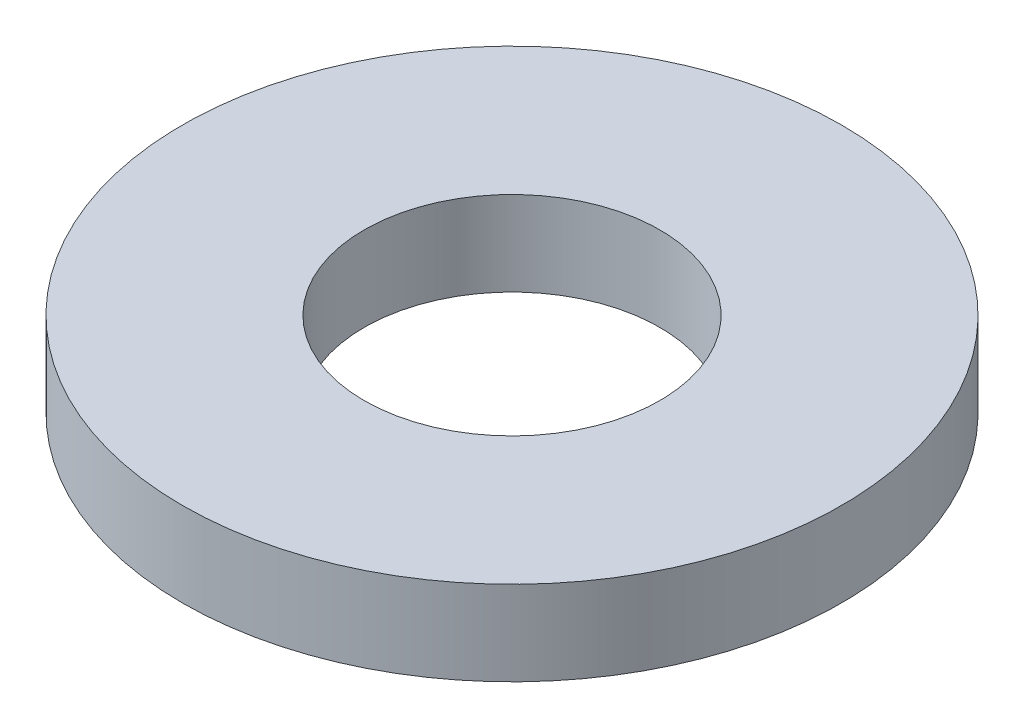
ISO-10303-21;
HEADER;
FILE_DESCRIPTION(('STEP AP214'),'2;1');
FILE_NAME('part.step','',(''),(''),'','','');
FILE_SCHEMA(('AUTOMOTIVE_DESIGN { 1 0 10303 214 1 1 1 1 }'));
ENDSEC;
DATA;
#1=APPLICATION_CONTEXT('core data for automotive mechanical design processes');
#2=APPLICATION_PROTOCOL_DEFINITION('international standard','automotive_design',2000,#1);
#3=PRODUCT_CONTEXT('',#1,'mechanical');
#4=PRODUCT('Part','Part','',(#3));
#5=PRODUCT_RELATED_PRODUCT_CATEGORY('part','',(#4));
#6=PRODUCT_DEFINITION_FORMATION('','',#4);
#7=PRODUCT_DEFINITION_CONTEXT('part definition',#1,'design');
#8=PRODUCT_DEFINITION('design','',#6,#7);
#9=PRODUCT_DEFINITION_SHAPE('','',#8);
#10=(LENGTH_UNIT() NAMED_UNIT(*) SI_UNIT(.MILLI.,.METRE.));
#11=(NAMED_UNIT(*) PLANE_ANGLE_UNIT() SI_UNIT($,.RADIAN.));
#12=(NAMED_UNIT(*) SI_UNIT($,.STERADIAN.) SOLID_ANGLE_UNIT());
#13=UNCERTAINTY_MEASURE_WITH_UNIT(LENGTH_MEASURE(1.E-05),#10,'distance_accuracy_value','');
#14=(GEOMETRIC_REPRESENTATION_CONTEXT(3) GLOBAL_UNCERTAINTY_ASSIGNED_CONTEXT((#13)) GLOBAL_UNIT_ASSIGNED_CONTEXT((#10,
#11,#12)) REPRESENTATION_CONTEXT('',''));
#15=CARTESIAN_POINT('',(0.,0.,0.));
#16=DIRECTION('',(0.,0.,1.));
#17=DIRECTION('',(1.,0.,0.));
#18=AXIS2_PLACEMENT_3D('',#15,#16,#17);
#19=CARTESIAN_POINT('',(0.,1.016,0.));
#20=DIRECTION('',(0.,-1.,0.));
#21=DIRECTION('',(0.,0.,-1.));
#22=AXIS2_PLACEMENT_3D('',#19,#20,#21);
#23=CYLINDRICAL_SURFACE('',#22,3.9624);
#24=CARTESIAN_POINT('',(0.,1.016,0.));
#25=DIRECTION('',(0.,1.,0.));
#26=DIRECTION('',(0.,0.,1.));
#27=AXIS2_PLACEMENT_3D('',#24,#25,#26);
#28=CIRCLE('',#27,3.9624);
#29=CARTESIAN_POINT('',(0.,1.016,3.9624));
#30=VERTEX_POINT('',#29);
#31=EDGE_CURVE('E10',#30,#30,#28,.T.);
#32=ORIENTED_EDGE('',*,*,#31,.F.);
#33=EDGE_LOOP('',(#32));
#34=FACE_BOUND('',#33,.T.);
#35=CARTESIAN_POINT('',(0.,0.,0.));
#36=DIRECTION('',(0.,1.,0.));
#37=DIRECTION('',(0.,0.,1.));
#38=AXIS2_PLACEMENT_3D('',#35,#36,#37);
#39=CIRCLE('',#38,3.9624);
#40=CARTESIAN_POINT('',(0.,0.,3.9624));
#41=VERTEX_POINT('',#40);
#42=EDGE_CURVE('E42',#41,#41,#39,.T.);
#43=ORIENTED_EDGE('',*,*,#42,.T.);
#44=EDGE_LOOP('',(#43));
#45=FACE_BOUND('',#44,.T.);
#46=ADVANCED_FACE('F39',(#34,#45),#23,.T.);
#47=CARTESIAN_POINT('',(0.,1.016,0.));
#48=DIRECTION('',(0.,1.,0.));
#49=DIRECTION('',(0.,0.,1.));
#50=AXIS2_PLACEMENT_3D('',#47,#48,#49);
#51=PLANE('',#50);
#52=CARTESIAN_POINT('',(0.,1.016,0.));
#53=DIRECTION('',(0.,1.,0.));
#54=DIRECTION('',(0.,0.,1.));
#55=AXIS2_PLACEMENT_3D('',#52,#53,#54);
#56=CIRCLE('',#55,1.778);
#57=CARTESIAN_POINT('',(0.,1.016,1.778));
#58=VERTEX_POINT('',#57);
#59=EDGE_CURVE('E54',#58,#58,#56,.T.);
#60=ORIENTED_EDGE('',*,*,#59,.F.);
#61=EDGE_LOOP('',(#60));
#62=FACE_BOUND('',#61,.T.);
#63=ORIENTED_EDGE('',*,*,#31,.T.);
#64=EDGE_LOOP('',(#63));
#65=FACE_BOUND('',#64,.T.);
#66=ADVANCED_FACE('F72',(#62,#65),#51,.T.);
#67=CARTESIAN_POINT('',(0.,0.,0.));
#68=DIRECTION('',(0.,1.,0.));
#69=DIRECTION('',(0.,0.,1.));
#70=AXIS2_PLACEMENT_3D('',#67,#68,#69);
#71=PLANE('',#70);
#72=CARTESIAN_POINT('',(0.,0.,0.));
#73=DIRECTION('',(0.,1.,0.));
#74=DIRECTION('',(0.,0.,1.));
#75=AXIS2_PLACEMENT_3D('',#72,#73,#74);
#76=CIRCLE('',#75,1.778);
#77=CARTESIAN_POINT('',(0.,0.,1.778));
#78=VERTEX_POINT('',#77);
#79=EDGE_CURVE('E52',#78,#78,#76,.T.);
#80=ORIENTED_EDGE('',*,*,#79,.T.);
#81=EDGE_LOOP('',(#80));
#82=FACE_BOUND('',#81,.T.);
#83=ORIENTED_EDGE('',*,*,#42,.F.);
#84=EDGE_LOOP('',(#83));
#85=FACE_BOUND('',#84,.T.);
#86=ADVANCED_FACE('F63',(#82,#85),#71,.F.);
#87=CARTESIAN_POINT('',(0.,0.,0.));
#88=DIRECTION('',(0.,1.,0.));
#89=DIRECTION('',(0.,0.,1.));
#90=AXIS2_PLACEMENT_3D('',#87,#88,#89);
#91=CYLINDRICAL_SURFACE('',#90,1.778);
#92=ORIENTED_EDGE('',*,*,#79,.F.);
#93=EDGE_LOOP('',(#92));
#94=FACE_BOUND('',#93,.T.);
#95=ORIENTED_EDGE('',*,*,#59,.T.);
#96=EDGE_LOOP('',(#95));
#97=FACE_BOUND('',#96,.T.);
#98=ADVANCED_FACE('F66',(#94,#97),#91,.F.);
#99=CLOSED_SHELL('',(#46,#66,#86,#98));
#100=MANIFOLD_SOLID_BREP('B2',#99);
#101=ADVANCED_BREP_SHAPE_REPRESENTATION('',(#18,#100),#14);
#102=SHAPE_DEFINITION_REPRESENTATION(#9,#101);
ENDSEC;
END-ISO-10303-21;
